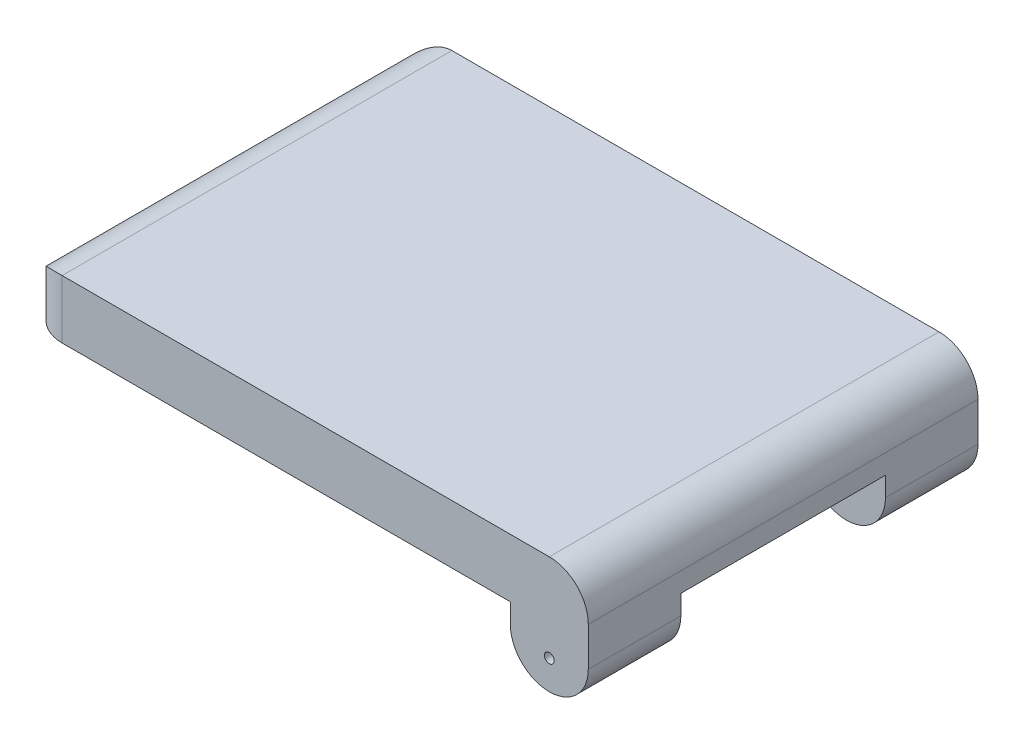
ISO-10303-21;
HEADER;
FILE_DESCRIPTION(('STEP AP214'),'2;1');
FILE_NAME('part.step','',(''),(''),'','','');
FILE_SCHEMA(('AUTOMOTIVE_DESIGN { 1 0 10303 214 1 1 1 1 }'));
ENDSEC;
DATA;
#1=APPLICATION_CONTEXT('core data for automotive mechanical design processes');
#2=APPLICATION_PROTOCOL_DEFINITION('international standard','automotive_design',2000,#1);
#3=PRODUCT_CONTEXT('',#1,'mechanical');
#4=PRODUCT('Part','Part','',(#3));
#5=PRODUCT_RELATED_PRODUCT_CATEGORY('part','',(#4));
#6=PRODUCT_DEFINITION_FORMATION('','',#4);
#7=PRODUCT_DEFINITION_CONTEXT('part definition',#1,'design');
#8=PRODUCT_DEFINITION('design','',#6,#7);
#9=PRODUCT_DEFINITION_SHAPE('','',#8);
#10=(LENGTH_UNIT() NAMED_UNIT(*) SI_UNIT(.MILLI.,.METRE.));
#11=(NAMED_UNIT(*) PLANE_ANGLE_UNIT() SI_UNIT($,.RADIAN.));
#12=(NAMED_UNIT(*) SI_UNIT($,.STERADIAN.) SOLID_ANGLE_UNIT());
#13=UNCERTAINTY_MEASURE_WITH_UNIT(LENGTH_MEASURE(1.E-05),#10,'distance_accuracy_value','');
#14=(GEOMETRIC_REPRESENTATION_CONTEXT(3) GLOBAL_UNCERTAINTY_ASSIGNED_CONTEXT((#13)) GLOBAL_UNIT_ASSIGNED_CONTEXT((#10,
#11,#12)) REPRESENTATION_CONTEXT('',''));
#15=CARTESIAN_POINT('',(0.,0.,0.));
#16=DIRECTION('',(0.,0.,1.));
#17=DIRECTION('',(1.,0.,0.));
#18=AXIS2_PLACEMENT_3D('',#15,#16,#17);
#19=CARTESIAN_POINT('',(0.,0.,0.));
#20=DIRECTION('',(0.,-1.,0.));
#21=DIRECTION('',(0.,0.,-1.));
#22=AXIS2_PLACEMENT_3D('',#19,#20,#21);
#23=PLANE('',#22);
#24=DIRECTION('',(1.,0.,0.));
#25=VECTOR('',#24,1.);
#26=CARTESIAN_POINT('',(-129.673147531233,0.,-110.465154765238));
#27=LINE('',#26,#25);
#28=CARTESIAN_POINT('',(-125.673147531233,0.,-110.465154765238));
#29=VERTEX_POINT('',#28);
#30=CARTESIAN_POINT('',(-79.6731475312328,0.,-110.465154765238));
#31=VERTEX_POINT('',#30);
#32=EDGE_CURVE('E174',#29,#31,#27,.T.);
#33=ORIENTED_EDGE('',*,*,#32,.F.);
#34=CARTESIAN_POINT('',(-125.673147531233,0.,-114.465154765238));
#35=DIRECTION('',(0.,-1.,0.));
#36=DIRECTION('',(0.,0.,-1.));
#37=AXIS2_PLACEMENT_3D('',#34,#35,#36);
#38=CIRCLE('',#37,4.);
#39=CARTESIAN_POINT('',(-129.673147531233,0.,-114.465154765238));
#40=VERTEX_POINT('',#39);
#41=EDGE_CURVE('E43',#29,#40,#38,.T.);
#42=ORIENTED_EDGE('',*,*,#41,.T.);
#43=DIRECTION('',(0.,0.,1.));
#44=VECTOR('',#43,1.);
#45=CARTESIAN_POINT('',(-129.673147531233,0.,-110.465154765238));
#46=LINE('',#45,#44);
#47=CARTESIAN_POINT('',(-129.673147531233,0.,-146.465154765238));
#48=VERTEX_POINT('',#47);
#49=EDGE_CURVE('E178',#48,#40,#46,.T.);
#50=ORIENTED_EDGE('',*,*,#49,.F.);
#51=CARTESIAN_POINT('',(-125.673147531233,0.,-146.465154765238));
#52=DIRECTION('',(0.,-1.,0.));
#53=DIRECTION('',(0.,0.,-1.));
#54=AXIS2_PLACEMENT_3D('',#51,#52,#53);
#55=CIRCLE('',#54,4.);
#56=CARTESIAN_POINT('',(-125.673147531233,0.,-150.465154765238));
#57=VERTEX_POINT('',#56);
#58=EDGE_CURVE('E51',#48,#57,#55,.T.);
#59=ORIENTED_EDGE('',*,*,#58,.T.);
#60=DIRECTION('',(-1.,0.,0.));
#61=VECTOR('',#60,1.);
#62=CARTESIAN_POINT('',(-129.673147531233,0.,-150.465154765238));
#63=LINE('',#62,#61);
#64=CARTESIAN_POINT('',(-79.6731475312328,0.,-150.465154765238));
#65=VERTEX_POINT('',#64);
#66=EDGE_CURVE('E173',#65,#57,#63,.T.);
#67=ORIENTED_EDGE('',*,*,#66,.F.);
#68=DIRECTION('',(0.,0.,-1.));
#69=VECTOR('',#68,1.);
#70=CARTESIAN_POINT('',(-79.6731475312328,0.,-150.465154765238));
#71=LINE('',#70,#69);
#72=CARTESIAN_POINT('',(-79.6731475312328,0.,-140.965154765238));
#73=VERTEX_POINT('',#72);
#74=EDGE_CURVE('E165',#73,#65,#71,.T.);
#75=ORIENTED_EDGE('',*,*,#74,.F.);
#76=DIRECTION('',(-1.,0.,0.));
#77=VECTOR('',#76,1.);
#78=CARTESIAN_POINT('',(-71.6731475312328,0.,-140.965154765238));
#79=LINE('',#78,#77);
#80=CARTESIAN_POINT('',(-71.6731475312328,0.,-140.965154765238));
#81=VERTEX_POINT('',#80);
#82=EDGE_CURVE('E149',#81,#73,#79,.T.);
#83=ORIENTED_EDGE('',*,*,#82,.F.);
#84=DIRECTION('',(0.,0.,-1.));
#85=VECTOR('',#84,1.);
#86=CARTESIAN_POINT('',(-71.6731475312328,0.,-110.465154765238));
#87=LINE('',#86,#85);
#88=CARTESIAN_POINT('',(-71.6731475312328,0.,-119.965154765238));
#89=VERTEX_POINT('',#88);
#90=EDGE_CURVE('E162',#89,#81,#87,.T.);
#91=ORIENTED_EDGE('',*,*,#90,.F.);
#92=DIRECTION('',(1.,0.,0.));
#93=VECTOR('',#92,1.);
#94=CARTESIAN_POINT('',(-71.6731475312328,0.,-119.965154765238));
#95=LINE('',#94,#93);
#96=CARTESIAN_POINT('',(-79.6731475312328,0.,-119.965154765238));
#97=VERTEX_POINT('',#96);
#98=EDGE_CURVE('E226',#97,#89,#95,.T.);
#99=ORIENTED_EDGE('',*,*,#98,.F.);
#100=DIRECTION('',(0.,0.,-1.));
#101=VECTOR('',#100,1.);
#102=CARTESIAN_POINT('',(-79.6731475312328,0.,-110.465154765238));
#103=LINE('',#102,#101);
#104=EDGE_CURVE('E157',#31,#97,#103,.T.);
#105=ORIENTED_EDGE('',*,*,#104,.F.);
#106=EDGE_LOOP('',(#33,#42,#50,#59,#67,#75,#83,#91,#99,#105));
#107=FACE_BOUND('',#106,.T.);
#108=ADVANCED_FACE('F34',(#107),#23,.T.);
#109=CARTESIAN_POINT('',(-129.673147531233,6.,-110.465154765238));
#110=DIRECTION('',(1.,0.,0.));
#111=DIRECTION('',(0.,0.,-1.));
#112=AXIS2_PLACEMENT_3D('',#109,#110,#111);
#113=PLANE('',#112);
#114=ORIENTED_EDGE('',*,*,#49,.T.);
#115=DIRECTION('',(0.,-1.,0.));
#116=VECTOR('',#115,1.);
#117=CARTESIAN_POINT('',(-129.673147531233,6.,-114.465154765238));
#118=LINE('',#117,#116);
#119=CARTESIAN_POINT('',(-129.673147531233,2.,-114.465154765238));
#120=VERTEX_POINT('',#119);
#121=EDGE_CURVE('E265',#40,#120,#118,.F.);
#122=ORIENTED_EDGE('',*,*,#121,.T.);
#123=DIRECTION('',(0.,0.,1.));
#124=VECTOR('',#123,1.);
#125=CARTESIAN_POINT('',(-129.673147531233,2.,-110.465154765238));
#126=LINE('',#125,#124);
#127=CARTESIAN_POINT('',(-129.673147531233,2.,-146.465154765238));
#128=VERTEX_POINT('',#127);
#129=EDGE_CURVE('E263',#120,#128,#126,.F.);
#130=ORIENTED_EDGE('',*,*,#129,.T.);
#131=DIRECTION('',(0.,-1.,0.));
#132=VECTOR('',#131,1.);
#133=CARTESIAN_POINT('',(-129.673147531233,6.,-146.465154765238));
#134=LINE('',#133,#132);
#135=EDGE_CURVE('E261',#128,#48,#134,.T.);
#136=ORIENTED_EDGE('',*,*,#135,.T.);
#137=EDGE_LOOP('',(#114,#122,#130,#136));
#138=FACE_BOUND('',#137,.T.);
#139=ADVANCED_FACE('F279',(#138),#113,.F.);
#140=CARTESIAN_POINT('',(-129.673147531233,6.,-110.465154765238));
#141=DIRECTION('',(0.,0.,-1.));
#142=DIRECTION('',(-1.,0.,0.));
#143=AXIS2_PLACEMENT_3D('',#140,#141,#142);
#144=PLANE('',#143);
#145=CARTESIAN_POINT('',(-75.6731475312328,-3.,-110.465154765238));
#146=DIRECTION('',(0.,0.,1.));
#147=DIRECTION('',(1.,0.,0.));
#148=AXIS2_PLACEMENT_3D('',#145,#146,#147);
#149=CIRCLE('',#148,0.499999999999999);
#150=CARTESIAN_POINT('',(-75.1731475312328,-3.,-110.465154765238));
#151=VERTEX_POINT('',#150);
#152=EDGE_CURVE('E243',#151,#151,#149,.T.);
#153=ORIENTED_EDGE('',*,*,#152,.F.);
#154=EDGE_LOOP('',(#153));
#155=FACE_BOUND('',#154,.T.);
#156=DIRECTION('',(1.,0.,0.));
#157=VECTOR('',#156,1.);
#158=CARTESIAN_POINT('',(-129.673147531233,6.,-110.465154765238));
#159=LINE('',#158,#157);
#160=CARTESIAN_POINT('',(-125.673147531233,6.,-110.465154765238));
#161=VERTEX_POINT('',#160);
#162=CARTESIAN_POINT('',(-75.6731475312328,6.,-110.465154765238));
#163=VERTEX_POINT('',#162);
#164=EDGE_CURVE('E176',#161,#163,#159,.T.);
#165=ORIENTED_EDGE('',*,*,#164,.F.);
#166=DIRECTION('',(0.,-1.,0.));
#167=VECTOR('',#166,1.);
#168=CARTESIAN_POINT('',(-125.673147531233,6.,-110.465154765238));
#169=LINE('',#168,#167);
#170=EDGE_CURVE('E59',#161,#29,#169,.T.);
#171=ORIENTED_EDGE('',*,*,#170,.T.);
#172=ORIENTED_EDGE('',*,*,#32,.T.);
#173=DIRECTION('',(0.,1.,0.));
#174=VECTOR('',#173,1.);
#175=CARTESIAN_POINT('',(-79.6731475312328,-6.,-110.465154765238));
#176=LINE('',#175,#174);
#177=CARTESIAN_POINT('',(-79.6731475312328,-2.,-110.465154765238));
#178=VERTEX_POINT('',#177);
#179=EDGE_CURVE('E206',#178,#31,#176,.T.);
#180=ORIENTED_EDGE('',*,*,#179,.F.);
#181=CARTESIAN_POINT('',(-75.6731475312328,-2.,-110.465154765238));
#182=DIRECTION('',(0.,0.,-1.));
#183=DIRECTION('',(-1.,0.,0.));
#184=AXIS2_PLACEMENT_3D('',#181,#182,#183);
#185=CIRCLE('',#184,4.);
#186=CARTESIAN_POINT('',(-75.6731475312328,-6.,-110.465154765238));
#187=VERTEX_POINT('',#186);
#188=EDGE_CURVE('E221',#178,#187,#185,.F.);
#189=ORIENTED_EDGE('',*,*,#188,.T.);
#190=CARTESIAN_POINT('',(-75.6731475312328,-2.,-110.465154765238));
#191=DIRECTION('',(0.,0.,-1.));
#192=DIRECTION('',(-1.,0.,0.));
#193=AXIS2_PLACEMENT_3D('',#190,#191,#192);
#194=CIRCLE('',#193,4.);
#195=CARTESIAN_POINT('',(-71.6731475312328,-2.,-110.465154765238));
#196=VERTEX_POINT('',#195);
#197=EDGE_CURVE('E293',#187,#196,#194,.F.);
#198=ORIENTED_EDGE('',*,*,#197,.T.);
#199=DIRECTION('',(0.,-1.,0.));
#200=VECTOR('',#199,1.);
#201=CARTESIAN_POINT('',(-71.6731475312328,6.,-110.465154765238));
#202=LINE('',#201,#200);
#203=CARTESIAN_POINT('',(-71.6731475312328,2.,-110.465154765238));
#204=VERTEX_POINT('',#203);
#205=EDGE_CURVE('E183',#204,#196,#202,.T.);
#206=ORIENTED_EDGE('',*,*,#205,.F.);
#207=CARTESIAN_POINT('',(-75.6731475312328,2.,-110.465154765238));
#208=DIRECTION('',(0.,0.,-1.));
#209=DIRECTION('',(-1.,0.,0.));
#210=AXIS2_PLACEMENT_3D('',#207,#208,#209);
#211=CIRCLE('',#210,4.);
#212=EDGE_CURVE('E288',#204,#163,#211,.F.);
#213=ORIENTED_EDGE('',*,*,#212,.T.);
#214=EDGE_LOOP('',(#165,#171,#172,#180,#189,#198,#206,#213));
#215=FACE_BOUND('',#214,.T.);
#216=ADVANCED_FACE('F285',(#155,#215),#144,.F.);
#217=CARTESIAN_POINT('',(-71.6731475312328,6.,-110.465154765238));
#218=DIRECTION('',(-1.,0.,0.));
#219=DIRECTION('',(0.,0.,1.));
#220=AXIS2_PLACEMENT_3D('',#217,#218,#219);
#221=PLANE('',#220);
#222=DIRECTION('',(0.,-1.,0.));
#223=VECTOR('',#222,1.);
#224=CARTESIAN_POINT('',(-71.6731475312328,6.,-150.465154765238));
#225=LINE('',#224,#223);
#226=CARTESIAN_POINT('',(-71.6731475312328,2.,-150.465154765238));
#227=VERTEX_POINT('',#226);
#228=CARTESIAN_POINT('',(-71.6731475312328,-2.,-150.465154765238));
#229=VERTEX_POINT('',#228);
#230=EDGE_CURVE('E190',#227,#229,#225,.T.);
#231=ORIENTED_EDGE('',*,*,#230,.F.);
#232=DIRECTION('',(0.,0.,-1.));
#233=VECTOR('',#232,1.);
#234=CARTESIAN_POINT('',(-71.6731475312328,2.,-110.465154765238));
#235=LINE('',#234,#233);
#236=EDGE_CURVE('E219',#227,#204,#235,.F.);
#237=ORIENTED_EDGE('',*,*,#236,.T.);
#238=ORIENTED_EDGE('',*,*,#205,.T.);
#239=DIRECTION('',(0.,0.,1.));
#240=VECTOR('',#239,1.);
#241=CARTESIAN_POINT('',(-71.6731475312328,-2.,-110.465154765238));
#242=LINE('',#241,#240);
#243=CARTESIAN_POINT('',(-71.6731475312328,-2.,-119.965154765238));
#244=VERTEX_POINT('',#243);
#245=EDGE_CURVE('E304',#196,#244,#242,.F.);
#246=ORIENTED_EDGE('',*,*,#245,.T.);
#247=DIRECTION('',(0.,1.,0.));
#248=VECTOR('',#247,1.);
#249=CARTESIAN_POINT('',(-71.6731475312328,-6.,-119.965154765238));
#250=LINE('',#249,#248);
#251=EDGE_CURVE('E172',#244,#89,#250,.T.);
#252=ORIENTED_EDGE('',*,*,#251,.T.);
#253=ORIENTED_EDGE('',*,*,#90,.T.);
#254=DIRECTION('',(0.,1.,0.));
#255=VECTOR('',#254,1.);
#256=CARTESIAN_POINT('',(-71.6731475312328,-6.,-140.965154765238));
#257=LINE('',#256,#255);
#258=CARTESIAN_POINT('',(-71.6731475312328,-2.,-140.965154765238));
#259=VERTEX_POINT('',#258);
#260=EDGE_CURVE('E145',#259,#81,#257,.T.);
#261=ORIENTED_EDGE('',*,*,#260,.F.);
#262=DIRECTION('',(0.,0.,1.));
#263=VECTOR('',#262,1.);
#264=CARTESIAN_POINT('',(-71.6731475312328,-2.,-150.465154765238));
#265=LINE('',#264,#263);
#266=EDGE_CURVE('E306',#259,#229,#265,.F.);
#267=ORIENTED_EDGE('',*,*,#266,.T.);
#268=EDGE_LOOP('',(#231,#237,#238,#246,#252,#253,#261,#267));
#269=FACE_BOUND('',#268,.T.);
#270=ADVANCED_FACE('F169',(#269),#221,.F.);
#271=CARTESIAN_POINT('',(-129.673147531233,6.,-150.465154765238));
#272=DIRECTION('',(0.,0.,1.));
#273=DIRECTION('',(1.,0.,0.));
#274=AXIS2_PLACEMENT_3D('',#271,#272,#273);
#275=PLANE('',#274);
#276=CARTESIAN_POINT('',(-75.6731475312328,-3.,-150.465154765238));
#277=DIRECTION('',(0.,0.,1.));
#278=DIRECTION('',(1.,0.,0.));
#279=AXIS2_PLACEMENT_3D('',#276,#277,#278);
#280=CIRCLE('',#279,0.499999999999999);
#281=CARTESIAN_POINT('',(-75.1731475312328,-3.,-150.465154765238));
#282=VERTEX_POINT('',#281);
#283=EDGE_CURVE('E240',#282,#282,#280,.F.);
#284=ORIENTED_EDGE('',*,*,#283,.F.);
#285=EDGE_LOOP('',(#284));
#286=FACE_BOUND('',#285,.T.);
#287=ORIENTED_EDGE('',*,*,#66,.T.);
#288=DIRECTION('',(0.,-1.,0.));
#289=VECTOR('',#288,1.);
#290=CARTESIAN_POINT('',(-125.673147531233,6.,-150.465154765238));
#291=LINE('',#290,#289);
#292=CARTESIAN_POINT('',(-125.673147531233,6.,-150.465154765238));
#293=VERTEX_POINT('',#292);
#294=EDGE_CURVE('E11',#57,#293,#291,.F.);
#295=ORIENTED_EDGE('',*,*,#294,.T.);
#296=DIRECTION('',(-1.,0.,0.));
#297=VECTOR('',#296,1.);
#298=CARTESIAN_POINT('',(-129.673147531233,6.,-150.465154765238));
#299=LINE('',#298,#297);
#300=CARTESIAN_POINT('',(-75.6731475312328,6.,-150.465154765238));
#301=VERTEX_POINT('',#300);
#302=EDGE_CURVE('E192',#301,#293,#299,.T.);
#303=ORIENTED_EDGE('',*,*,#302,.F.);
#304=CARTESIAN_POINT('',(-75.6731475312328,2.,-150.465154765238));
#305=DIRECTION('',(0.,0.,1.));
#306=DIRECTION('',(1.,0.,0.));
#307=AXIS2_PLACEMENT_3D('',#304,#305,#306);
#308=CIRCLE('',#307,4.);
#309=EDGE_CURVE('E296',#301,#227,#308,.F.);
#310=ORIENTED_EDGE('',*,*,#309,.T.);
#311=ORIENTED_EDGE('',*,*,#230,.T.);
#312=CARTESIAN_POINT('',(-75.6731475312328,-2.,-150.465154765238));
#313=DIRECTION('',(0.,0.,1.));
#314=DIRECTION('',(1.,0.,0.));
#315=AXIS2_PLACEMENT_3D('',#312,#313,#314);
#316=CIRCLE('',#315,4.);
#317=CARTESIAN_POINT('',(-75.6731475312328,-6.,-150.465154765238));
#318=VERTEX_POINT('',#317);
#319=EDGE_CURVE('E299',#229,#318,#316,.F.);
#320=ORIENTED_EDGE('',*,*,#319,.T.);
#321=CARTESIAN_POINT('',(-75.6731475312328,-2.,-150.465154765238));
#322=DIRECTION('',(0.,0.,1.));
#323=DIRECTION('',(1.,0.,0.));
#324=AXIS2_PLACEMENT_3D('',#321,#322,#323);
#325=CIRCLE('',#324,4.);
#326=CARTESIAN_POINT('',(-79.6731475312328,-2.,-150.465154765238));
#327=VERTEX_POINT('',#326);
#328=EDGE_CURVE('E297',#318,#327,#325,.F.);
#329=ORIENTED_EDGE('',*,*,#328,.T.);
#330=DIRECTION('',(0.,1.,0.));
#331=VECTOR('',#330,1.);
#332=CARTESIAN_POINT('',(-79.6731475312328,-6.,-150.465154765238));
#333=LINE('',#332,#331);
#334=EDGE_CURVE('E234',#327,#65,#333,.T.);
#335=ORIENTED_EDGE('',*,*,#334,.T.);
#336=EDGE_LOOP('',(#287,#295,#303,#310,#311,#320,#329,#335));
#337=FACE_BOUND('',#336,.T.);
#338=ADVANCED_FACE('F347',(#286,#337),#275,.F.);
#339=CARTESIAN_POINT('',(0.,6.,0.));
#340=DIRECTION('',(0.,-1.,0.));
#341=DIRECTION('',(0.,0.,-1.));
#342=AXIS2_PLACEMENT_3D('',#339,#340,#341);
#343=PLANE('',#342);
#344=ORIENTED_EDGE('',*,*,#302,.T.);
#345=DIRECTION('',(0.,0.,1.));
#346=VECTOR('',#345,1.);
#347=CARTESIAN_POINT('',(-125.673147531233,6.,0.));
#348=LINE('',#347,#346);
#349=EDGE_CURVE('E259',#293,#161,#348,.T.);
#350=ORIENTED_EDGE('',*,*,#349,.T.);
#351=ORIENTED_EDGE('',*,*,#164,.T.);
#352=DIRECTION('',(0.,0.,-1.));
#353=VECTOR('',#352,1.);
#354=CARTESIAN_POINT('',(-75.6731475312328,6.,0.));
#355=LINE('',#354,#353);
#356=EDGE_CURVE('E195',#163,#301,#355,.T.);
#357=ORIENTED_EDGE('',*,*,#356,.T.);
#358=EDGE_LOOP('',(#344,#350,#351,#357));
#359=FACE_BOUND('',#358,.T.);
#360=ADVANCED_FACE('F283',(#359),#343,.F.);
#361=CARTESIAN_POINT('',(-79.6731475312328,-6.,-110.465154765238));
#362=DIRECTION('',(1.,0.,0.));
#363=DIRECTION('',(0.,0.,-1.));
#364=AXIS2_PLACEMENT_3D('',#361,#362,#363);
#365=PLANE('',#364);
#366=DIRECTION('',(0.,1.,0.));
#367=VECTOR('',#366,1.);
#368=CARTESIAN_POINT('',(-79.6731475312328,-6.,-119.965154765238));
#369=LINE('',#368,#367);
#370=CARTESIAN_POINT('',(-79.6731475312328,-2.,-119.965154765238));
#371=VERTEX_POINT('',#370);
#372=EDGE_CURVE('E210',#371,#97,#369,.T.);
#373=ORIENTED_EDGE('',*,*,#372,.F.);
#374=DIRECTION('',(0.,0.,-1.));
#375=VECTOR('',#374,1.);
#376=CARTESIAN_POINT('',(-79.6731475312328,-2.,-110.465154765238));
#377=LINE('',#376,#375);
#378=EDGE_CURVE('E256',#371,#178,#377,.F.);
#379=ORIENTED_EDGE('',*,*,#378,.T.);
#380=ORIENTED_EDGE('',*,*,#179,.T.);
#381=ORIENTED_EDGE('',*,*,#104,.T.);
#382=EDGE_LOOP('',(#373,#379,#380,#381));
#383=FACE_BOUND('',#382,.T.);
#384=ADVANCED_FACE('F321',(#383),#365,.F.);
#385=CARTESIAN_POINT('',(-71.6731475312328,-6.,-119.965154765238));
#386=DIRECTION('',(0.,0.,1.));
#387=DIRECTION('',(1.,0.,0.));
#388=AXIS2_PLACEMENT_3D('',#385,#386,#387);
#389=PLANE('',#388);
#390=CARTESIAN_POINT('',(-75.6731475312328,-3.,-119.965154765238));
#391=DIRECTION('',(0.,0.,1.));
#392=DIRECTION('',(1.,0.,0.));
#393=AXIS2_PLACEMENT_3D('',#390,#391,#392);
#394=CIRCLE('',#393,0.499999999999999);
#395=CARTESIAN_POINT('',(-75.1731475312328,-3.,-119.965154765238));
#396=VERTEX_POINT('',#395);
#397=EDGE_CURVE('E166',#396,#396,#394,.T.);
#398=ORIENTED_EDGE('',*,*,#397,.T.);
#399=EDGE_LOOP('',(#398));
#400=FACE_BOUND('',#399,.T.);
#401=ORIENTED_EDGE('',*,*,#251,.F.);
#402=CARTESIAN_POINT('',(-75.6731475312328,-2.,-119.965154765238));
#403=DIRECTION('',(0.,0.,1.));
#404=DIRECTION('',(1.,0.,0.));
#405=AXIS2_PLACEMENT_3D('',#402,#403,#404);
#406=CIRCLE('',#405,4.);
#407=CARTESIAN_POINT('',(-75.6731475312328,-6.,-119.965154765238));
#408=VERTEX_POINT('',#407);
#409=EDGE_CURVE('E316',#244,#408,#406,.F.);
#410=ORIENTED_EDGE('',*,*,#409,.T.);
#411=CARTESIAN_POINT('',(-75.6731475312328,-2.,-119.965154765238));
#412=DIRECTION('',(0.,0.,1.));
#413=DIRECTION('',(1.,0.,0.));
#414=AXIS2_PLACEMENT_3D('',#411,#412,#413);
#415=CIRCLE('',#414,4.);
#416=EDGE_CURVE('E315',#408,#371,#415,.F.);
#417=ORIENTED_EDGE('',*,*,#416,.T.);
#418=ORIENTED_EDGE('',*,*,#372,.T.);
#419=ORIENTED_EDGE('',*,*,#98,.T.);
#420=EDGE_LOOP('',(#401,#410,#417,#418,#419));
#421=FACE_BOUND('',#420,.T.);
#422=ADVANCED_FACE('F327',(#400,#421),#389,.F.);
#423=CARTESIAN_POINT('',(-71.6731475312328,-6.,-140.965154765238));
#424=DIRECTION('',(0.,0.,-1.));
#425=DIRECTION('',(-1.,0.,0.));
#426=AXIS2_PLACEMENT_3D('',#423,#424,#425);
#427=PLANE('',#426);
#428=CARTESIAN_POINT('',(-75.6731475312328,-3.,-140.965154765238));
#429=DIRECTION('',(0.,0.,-1.));
#430=DIRECTION('',(-1.,0.,0.));
#431=AXIS2_PLACEMENT_3D('',#428,#429,#430);
#432=CIRCLE('',#431,0.499999999999999);
#433=CARTESIAN_POINT('',(-76.1731475312328,-3.,-140.965154765238));
#434=VERTEX_POINT('',#433);
#435=EDGE_CURVE('E239',#434,#434,#432,.T.);
#436=ORIENTED_EDGE('',*,*,#435,.T.);
#437=EDGE_LOOP('',(#436));
#438=FACE_BOUND('',#437,.T.);
#439=CARTESIAN_POINT('',(-75.6731475312328,-2.,-140.965154765238));
#440=DIRECTION('',(0.,0.,-1.));
#441=DIRECTION('',(-1.,0.,0.));
#442=AXIS2_PLACEMENT_3D('',#439,#440,#441);
#443=CIRCLE('',#442,4.);
#444=CARTESIAN_POINT('',(-79.6731475312328,-2.,-140.965154765238));
#445=VERTEX_POINT('',#444);
#446=CARTESIAN_POINT('',(-75.6731475312328,-6.,-140.965154765238));
#447=VERTEX_POINT('',#446);
#448=EDGE_CURVE('E292',#445,#447,#443,.F.);
#449=ORIENTED_EDGE('',*,*,#448,.T.);
#450=CARTESIAN_POINT('',(-75.6731475312328,-2.,-140.965154765238));
#451=DIRECTION('',(0.,0.,-1.));
#452=DIRECTION('',(-1.,0.,0.));
#453=AXIS2_PLACEMENT_3D('',#450,#451,#452);
#454=CIRCLE('',#453,4.);
#455=EDGE_CURVE('E152',#447,#259,#454,.F.);
#456=ORIENTED_EDGE('',*,*,#455,.T.);
#457=ORIENTED_EDGE('',*,*,#260,.T.);
#458=ORIENTED_EDGE('',*,*,#82,.T.);
#459=DIRECTION('',(0.,1.,0.));
#460=VECTOR('',#459,1.);
#461=CARTESIAN_POINT('',(-79.6731475312328,-6.,-140.965154765238));
#462=LINE('',#461,#460);
#463=EDGE_CURVE('E158',#445,#73,#462,.T.);
#464=ORIENTED_EDGE('',*,*,#463,.F.);
#465=EDGE_LOOP('',(#449,#456,#457,#458,#464));
#466=FACE_BOUND('',#465,.T.);
#467=ADVANCED_FACE('F147',(#438,#466),#427,.F.);
#468=CARTESIAN_POINT('',(-79.6731475312328,-6.,-150.465154765238));
#469=DIRECTION('',(1.,0.,0.));
#470=DIRECTION('',(0.,0.,-1.));
#471=AXIS2_PLACEMENT_3D('',#468,#469,#470);
#472=PLANE('',#471);
#473=ORIENTED_EDGE('',*,*,#334,.F.);
#474=DIRECTION('',(0.,0.,-1.));
#475=VECTOR('',#474,1.);
#476=CARTESIAN_POINT('',(-79.6731475312328,-2.,-140.965154765238));
#477=LINE('',#476,#475);
#478=EDGE_CURVE('E313',#327,#445,#477,.F.);
#479=ORIENTED_EDGE('',*,*,#478,.T.);
#480=ORIENTED_EDGE('',*,*,#463,.T.);
#481=ORIENTED_EDGE('',*,*,#74,.T.);
#482=EDGE_LOOP('',(#473,#479,#480,#481));
#483=FACE_BOUND('',#482,.T.);
#484=ADVANCED_FACE('F335',(#483),#472,.F.);
#485=CARTESIAN_POINT('',(-75.6731475312328,-3.,-151.879368327611));
#486=DIRECTION('',(0.,0.,1.));
#487=DIRECTION('',(1.,0.,0.));
#488=AXIS2_PLACEMENT_3D('',#485,#486,#487);
#489=CYLINDRICAL_SURFACE('',#488,0.499999999999999);
#490=ORIENTED_EDGE('',*,*,#283,.T.);
#491=EDGE_LOOP('',(#490));
#492=FACE_BOUND('',#491,.T.);
#493=ORIENTED_EDGE('',*,*,#435,.F.);
#494=EDGE_LOOP('',(#493));
#495=FACE_BOUND('',#494,.T.);
#496=ADVANCED_FACE('F405',(#492,#495),#489,.F.);
#497=ORIENTED_EDGE('',*,*,#152,.T.);
#498=EDGE_LOOP('',(#497));
#499=FACE_BOUND('',#498,.T.);
#500=ORIENTED_EDGE('',*,*,#397,.F.);
#501=EDGE_LOOP('',(#500));
#502=FACE_BOUND('',#501,.T.);
#503=ADVANCED_FACE('F359',(#499,#502),#489,.F.);
#504=CARTESIAN_POINT('',(-75.6731475312328,2.,0.));
#505=DIRECTION('',(0.,0.,-1.));
#506=DIRECTION('',(-1.,0.,0.));
#507=AXIS2_PLACEMENT_3D('',#504,#505,#506);
#508=CYLINDRICAL_SURFACE('',#507,4.);
#509=ORIENTED_EDGE('',*,*,#212,.F.);
#510=ORIENTED_EDGE('',*,*,#236,.F.);
#511=ORIENTED_EDGE('',*,*,#309,.F.);
#512=ORIENTED_EDGE('',*,*,#356,.F.);
#513=EDGE_LOOP('',(#509,#510,#511,#512));
#514=FACE_BOUND('',#513,.T.);
#515=ADVANCED_FACE('F295',(#514),#508,.T.);
#516=CARTESIAN_POINT('',(-75.6731475312328,-2.,0.));
#517=DIRECTION('',(0.,0.,1.));
#518=DIRECTION('',(1.,0.,0.));
#519=AXIS2_PLACEMENT_3D('',#516,#517,#518);
#520=CYLINDRICAL_SURFACE('',#519,4.);
#521=ORIENTED_EDGE('',*,*,#478,.F.);
#522=ORIENTED_EDGE('',*,*,#328,.F.);
#523=DIRECTION('',(0.,0.,-1.));
#524=VECTOR('',#523,1.);
#525=CARTESIAN_POINT('',(-75.6731475312328,-6.,-150.465154765238));
#526=LINE('',#525,#524);
#527=EDGE_CURVE('E245',#447,#318,#526,.T.);
#528=ORIENTED_EDGE('',*,*,#527,.F.);
#529=ORIENTED_EDGE('',*,*,#448,.F.);
#530=EDGE_LOOP('',(#521,#522,#528,#529));
#531=FACE_BOUND('',#530,.T.);
#532=ADVANCED_FACE('F358',(#531),#520,.T.);
#533=CARTESIAN_POINT('',(-75.6731475312328,-2.,0.));
#534=DIRECTION('',(0.,0.,-1.));
#535=DIRECTION('',(-1.,0.,0.));
#536=AXIS2_PLACEMENT_3D('',#533,#534,#535);
#537=CYLINDRICAL_SURFACE('',#536,4.);
#538=ORIENTED_EDGE('',*,*,#319,.F.);
#539=ORIENTED_EDGE('',*,*,#266,.F.);
#540=ORIENTED_EDGE('',*,*,#455,.F.);
#541=ORIENTED_EDGE('',*,*,#527,.T.);
#542=EDGE_LOOP('',(#538,#539,#540,#541));
#543=FACE_BOUND('',#542,.T.);
#544=ADVANCED_FACE('F360',(#543),#537,.T.);
#545=CARTESIAN_POINT('',(-75.6731475312328,-2.,0.));
#546=DIRECTION('',(0.,0.,-1.));
#547=DIRECTION('',(-1.,0.,0.));
#548=AXIS2_PLACEMENT_3D('',#545,#546,#547);
#549=CYLINDRICAL_SURFACE('',#548,4.);
#550=ORIENTED_EDGE('',*,*,#378,.F.);
#551=ORIENTED_EDGE('',*,*,#416,.F.);
#552=DIRECTION('',(0.,0.,-1.));
#553=VECTOR('',#552,1.);
#554=CARTESIAN_POINT('',(-75.6731475312328,-6.,0.));
#555=LINE('',#554,#553);
#556=EDGE_CURVE('E249',#187,#408,#555,.T.);
#557=ORIENTED_EDGE('',*,*,#556,.F.);
#558=ORIENTED_EDGE('',*,*,#188,.F.);
#559=EDGE_LOOP('',(#550,#551,#557,#558));
#560=FACE_BOUND('',#559,.T.);
#561=ADVANCED_FACE('F323',(#560),#549,.T.);
#562=CARTESIAN_POINT('',(-75.6731475312328,-2.,0.));
#563=DIRECTION('',(0.,0.,1.));
#564=DIRECTION('',(1.,0.,0.));
#565=AXIS2_PLACEMENT_3D('',#562,#563,#564);
#566=CYLINDRICAL_SURFACE('',#565,4.);
#567=ORIENTED_EDGE('',*,*,#409,.F.);
#568=ORIENTED_EDGE('',*,*,#245,.F.);
#569=ORIENTED_EDGE('',*,*,#197,.F.);
#570=ORIENTED_EDGE('',*,*,#556,.T.);
#571=EDGE_LOOP('',(#567,#568,#569,#570));
#572=FACE_BOUND('',#571,.T.);
#573=ADVANCED_FACE('F326',(#572),#566,.T.);
#574=CARTESIAN_POINT('',(-125.673147531233,6.,-146.465154765238));
#575=DIRECTION('',(0.,-1.,0.));
#576=DIRECTION('',(0.,0.,-1.));
#577=AXIS2_PLACEMENT_3D('',#574,#575,#576);
#578=CYLINDRICAL_SURFACE('',#577,4.);
#579=ORIENTED_EDGE('',*,*,#58,.F.);
#580=ORIENTED_EDGE('',*,*,#135,.F.);
#581=CARTESIAN_POINT('',(-125.673147531233,2.,-146.465154765238));
#582=DIRECTION('',(0.,-0.707106781186547,-0.707106781186547));
#583=DIRECTION('',(0.,-0.707106781186547,0.707106781186547));
#584=AXIS2_PLACEMENT_3D('',#581,#582,#583);
#585=ELLIPSE('',#584,5.65685424949238,4.);
#586=EDGE_CURVE('E38',#293,#128,#585,.F.);
#587=ORIENTED_EDGE('',*,*,#586,.F.);
#588=ORIENTED_EDGE('',*,*,#294,.F.);
#589=EDGE_LOOP('',(#579,#580,#587,#588));
#590=FACE_BOUND('',#589,.T.);
#591=ADVANCED_FACE('F36',(#590),#578,.T.);
#592=CARTESIAN_POINT('',(-125.673147531233,6.,-114.465154765238));
#593=DIRECTION('',(0.,-1.,0.));
#594=DIRECTION('',(0.,0.,-1.));
#595=AXIS2_PLACEMENT_3D('',#592,#593,#594);
#596=CYLINDRICAL_SURFACE('',#595,4.);
#597=ORIENTED_EDGE('',*,*,#41,.F.);
#598=ORIENTED_EDGE('',*,*,#170,.F.);
#599=CARTESIAN_POINT('',(-125.673147531233,2.,-114.465154765238));
#600=DIRECTION('',(0.,-0.707106781186547,0.707106781186547));
#601=DIRECTION('',(0.,-0.707106781186547,-0.707106781186547));
#602=AXIS2_PLACEMENT_3D('',#599,#600,#601);
#603=ELLIPSE('',#602,5.65685424949238,4.);
#604=EDGE_CURVE('E269',#120,#161,#603,.F.);
#605=ORIENTED_EDGE('',*,*,#604,.F.);
#606=ORIENTED_EDGE('',*,*,#121,.F.);
#607=EDGE_LOOP('',(#597,#598,#605,#606));
#608=FACE_BOUND('',#607,.T.);
#609=ADVANCED_FACE('F282',(#608),#596,.T.);
#610=CARTESIAN_POINT('',(-125.673147531233,2.,0.));
#611=DIRECTION('',(0.,0.,1.));
#612=DIRECTION('',(1.,0.,0.));
#613=AXIS2_PLACEMENT_3D('',#610,#611,#612);
#614=CYLINDRICAL_SURFACE('',#613,4.);
#615=ORIENTED_EDGE('',*,*,#586,.T.);
#616=ORIENTED_EDGE('',*,*,#129,.F.);
#617=ORIENTED_EDGE('',*,*,#604,.T.);
#618=ORIENTED_EDGE('',*,*,#349,.F.);
#619=EDGE_LOOP('',(#615,#616,#617,#618));
#620=FACE_BOUND('',#619,.T.);
#621=ADVANCED_FACE('F275',(#620),#614,.T.);
#622=CLOSED_SHELL('',(#108,#139,#216,#270,#338,#360,#384,#422,#467,#484,#496,#503,#515,#532,
#544,#561,#573,#591,#609,#621));
#623=MANIFOLD_SOLID_BREP('B2',#622);
#624=ADVANCED_BREP_SHAPE_REPRESENTATION('',(#18,#623),#14);
#625=SHAPE_DEFINITION_REPRESENTATION(#9,#624);
ENDSEC;
END-ISO-10303-21;
